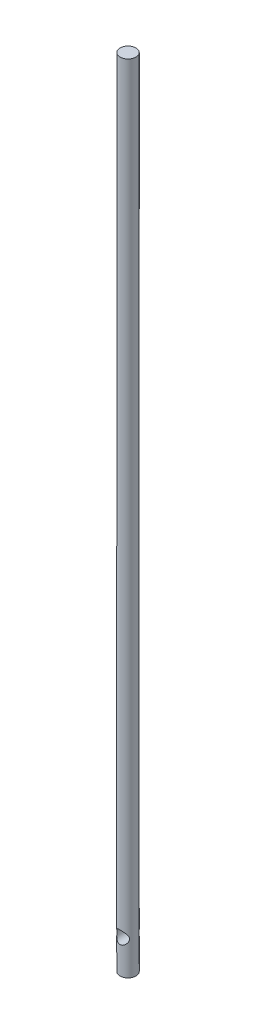
ISO-10303-21;
HEADER;
FILE_DESCRIPTION(('STEP AP214'),'2;1');
FILE_NAME('part.step','',(''),(''),'','','');
FILE_SCHEMA(('AUTOMOTIVE_DESIGN { 1 0 10303 214 1 1 1 1 }'));
ENDSEC;
DATA;
#1=APPLICATION_CONTEXT('core data for automotive mechanical design processes');
#2=APPLICATION_PROTOCOL_DEFINITION('international standard','automotive_design',2000,#1);
#3=PRODUCT_CONTEXT('',#1,'mechanical');
#4=PRODUCT('Part','Part','',(#3));
#5=PRODUCT_RELATED_PRODUCT_CATEGORY('part','',(#4));
#6=PRODUCT_DEFINITION_FORMATION('','',#4);
#7=PRODUCT_DEFINITION_CONTEXT('part definition',#1,'design');
#8=PRODUCT_DEFINITION('design','',#6,#7);
#9=PRODUCT_DEFINITION_SHAPE('','',#8);
#10=(LENGTH_UNIT() NAMED_UNIT(*) SI_UNIT(.MILLI.,.METRE.));
#11=(NAMED_UNIT(*) PLANE_ANGLE_UNIT() SI_UNIT($,.RADIAN.));
#12=(NAMED_UNIT(*) SI_UNIT($,.STERADIAN.) SOLID_ANGLE_UNIT());
#13=UNCERTAINTY_MEASURE_WITH_UNIT(LENGTH_MEASURE(1.E-05),#10,'distance_accuracy_value','');
#14=(GEOMETRIC_REPRESENTATION_CONTEXT(3) GLOBAL_UNCERTAINTY_ASSIGNED_CONTEXT((#13)) GLOBAL_UNIT_ASSIGNED_CONTEXT((#10,
#11,#12)) REPRESENTATION_CONTEXT('',''));
#15=CARTESIAN_POINT('',(0.,0.,0.));
#16=DIRECTION('',(0.,0.,1.));
#17=DIRECTION('',(1.,0.,0.));
#18=AXIS2_PLACEMENT_3D('',#15,#16,#17);
#19=CARTESIAN_POINT('',(0.,150.,0.));
#20=DIRECTION('',(0.,-1.,0.));
#21=DIRECTION('',(0.,0.,-1.));
#22=AXIS2_PLACEMENT_3D('',#19,#20,#21);
#23=CYLINDRICAL_SURFACE('',#22,1.5);
#24=DIRECTION('',(0.,-1.,0.));
#25=VECTOR('',#24,1.);
#26=CARTESIAN_POINT('',(1.2,150.,-0.900000000000006));
#27=LINE('',#26,#25);
#28=CARTESIAN_POINT('',(1.20000000000001,10.9306229712693,-0.899999999999984));
#29=VERTEX_POINT('',#28);
#30=CARTESIAN_POINT('',(1.2,123.985472487059,-0.900000000000007));
#31=VERTEX_POINT('',#30);
#32=EDGE_CURVE('E51',#29,#31,#27,.F.);
#33=ORIENTED_EDGE('',*,*,#32,.T.);
#34=CARTESIAN_POINT('',(1.2,123.985472487059,-0.900000000000002));
#35=CARTESIAN_POINT('',(1.20000379597152,124.008241141092,-0.899988421769051));
#36=CARTESIAN_POINT('',(1.19935171237671,124.030995344568,-0.900864818335987));
#37=CARTESIAN_POINT('',(1.19677380579347,124.07626730715,-0.904289605031));
#38=CARTESIAN_POINT('',(1.19485014367045,124.098785401655,-0.906835158607257));
#39=CARTESIAN_POINT('',(1.1872957434026,124.165171525524,-0.916732465008068));
#40=CARTESIAN_POINT('',(1.17987918100504,124.208511218388,-0.926350808630964));
#41=CARTESIAN_POINT('',(1.15736069729631,124.307919272878,-0.954429377374244));
#42=CARTESIAN_POINT('',(1.14046015532011,124.363006788641,-0.974820455416412));
#43=CARTESIAN_POINT('',(1.09982810438073,124.468814940031,-1.02045110491379));
#44=CARTESIAN_POINT('',(1.07604646211563,124.519499842435,-1.04572579064923));
#45=CARTESIAN_POINT('',(1.01264694209284,124.633713635883,-1.10776879771684));
#46=CARTESIAN_POINT('',(0.970408972520711,124.695319017802,-1.14540529134802));
#47=CARTESIAN_POINT('',(0.875114767435763,124.80991477859,-1.21976744864415));
#48=CARTESIAN_POINT('',(0.822079207567976,124.862921279492,-1.25649470481222));
#49=CARTESIAN_POINT('',(0.716860547634883,124.949731934184,-1.31874142866441));
#50=CARTESIAN_POINT('',(0.666569636231381,124.985261664013,-1.34504317856607));
#51=CARTESIAN_POINT('',(0.559477416211532,125.04888680401,-1.39298689109434));
#52=CARTESIAN_POINT('',(0.50268518991465,125.076992408299,-1.41463523565421));
#53=CARTESIAN_POINT('',(0.3931895960337,125.12050052944,-1.44849406958501));
#54=CARTESIAN_POINT('',(0.341310797441846,125.137222463066,-1.46166475924237));
#55=CARTESIAN_POINT('',(0.234711407110358,125.16357195401,-1.48251567469718));
#56=CARTESIAN_POINT('',(0.179992462378052,125.173203574882,-1.49019904527576));
#57=CARTESIAN_POINT('',(0.0690288367933391,125.18478736027,-1.49944782663458));
#58=CARTESIAN_POINT('',(0.0127795282977063,125.186712813777,-1.50099195754683));
#59=CARTESIAN_POINT('',(-0.0992501528541439,125.182673910964,-1.49776158870682));
#60=CARTESIAN_POINT('',(-0.155030506500741,125.176709236344,-1.49298683404227));
#61=CARTESIAN_POINT('',(-0.261408903545348,125.157831914293,-1.47797036912569));
#62=CARTESIAN_POINT('',(-0.31212368393574,125.145315794376,-1.46804090555009));
#63=CARTESIAN_POINT('',(-0.410500829334207,125.114256238575,-1.44362765637963));
#64=CARTESIAN_POINT('',(-0.45816227317499,125.095710993908,-1.42914250408594));
#65=CARTESIAN_POINT('',(-0.554122405601283,125.05130927328,-1.39491518620292));
#66=CARTESIAN_POINT('',(-0.602039307583846,125.024920203359,-1.37480076774247));
#67=CARTESIAN_POINT('',(-0.692835642600915,124.96674218442,-1.3313586633505));
#68=CARTESIAN_POINT('',(-0.73571344935812,124.93495150018,-1.30802994530972));
#69=CARTESIAN_POINT('',(-0.824531547625251,124.859658547501,-1.25433774240164));
#70=CARTESIAN_POINT('',(-0.869289812565461,124.815092135398,-1.22351390047361));
#71=CARTESIAN_POINT('',(-0.951188034986136,124.719777534196,-1.16099032606037));
#72=CARTESIAN_POINT('',(-0.988309742696429,124.669014988092,-1.12928869616512));
#73=CARTESIAN_POINT('',(-1.05143886251965,124.56662818867,-1.07058501887242));
#74=CARTESIAN_POINT('',(-1.07816635173084,124.515541974705,-1.04342237293823));
#75=CARTESIAN_POINT('',(-1.12442221587202,124.408610088671,-0.993389771838625));
#76=CARTESIAN_POINT('',(-1.14399751625862,124.352798511657,-0.970492337469131));
#77=CARTESIAN_POINT('',(-1.17243395506615,124.246044016715,-0.935854389368956));
#78=CARTESIAN_POINT('',(-1.18254432845917,124.195864281903,-0.922884307029407));
#79=CARTESIAN_POINT('',(-1.19289559254927,124.118490015245,-0.909413575041387));
#80=CARTESIAN_POINT('',(-1.19554493353033,124.092125775905,-0.905917470109911));
#81=CARTESIAN_POINT('',(-1.19910317111515,124.039008093284,-0.901196368348652));
#82=CARTESIAN_POINT('',(-1.20000727269517,124.012253780635,-0.899977628844882));
#83=CARTESIAN_POINT('',(-1.20000000000001,123.985472487059,-0.900000000000055));
#84=B_SPLINE_CURVE_WITH_KNOTS('',3,(#34,#35,#36,#37,#38,#39,#40,#41,#42,#43,#44,#45,#46,#47,#48,
#49,#50,#51,#52,#53,#54,#55,#56,#57,#58,#59,#60,#61,#62,#63,#64,#65,#66,#67,#68,#69,#70,#71,#72,
#73,#74,#75,#76,#77,#78,#79,#80,#81,#82,#83),.UNSPECIFIED.,.F.,.F.,(4,2,2,2,2,2,2,2,2,2,2,2,2,2,
2,2,2,2,2,2,2,2,2,2,4),(0.,0.0682543160829039,0.136392940903482,0.270779738696093,
0.453152803043748,0.636889553840028,0.886604805818232,1.13584631619644,1.33596404855176,
1.53580555230553,1.70332152707142,1.87074142126939,2.03874112396752,2.20674760420422,
2.36559449370376,2.52448908252779,2.69870670317353,2.87298039590935,3.08307483244179,
3.29366566282318,3.48428958120517,3.67363935120096,3.83109814308671,3.91113314478717,
3.99138773042926),.UNSPECIFIED.);
#85=CARTESIAN_POINT('',(-1.2,123.985472487059,-0.899999999999998));
#86=VERTEX_POINT('',#85);
#87=EDGE_CURVE('E11',#31,#86,#84,.T.);
#88=ORIENTED_EDGE('',*,*,#87,.T.);
#89=DIRECTION('',(0.,-1.,0.));
#90=VECTOR('',#89,1.);
#91=CARTESIAN_POINT('',(-1.2,150.,-0.899999999999998));
#92=LINE('',#91,#90);
#93=CARTESIAN_POINT('',(-1.2,10.9306229712693,-0.899999999999998));
#94=VERTEX_POINT('',#93);
#95=EDGE_CURVE('E85',#86,#94,#92,.T.);
#96=ORIENTED_EDGE('',*,*,#95,.T.);
#97=CARTESIAN_POINT('',(-1.2,10.9306229712693,-0.900000000000002));
#98=CARTESIAN_POINT('',(-1.20000379597152,10.9078543172356,-0.899988421769051));
#99=CARTESIAN_POINT('',(-1.19935171237671,10.8851001137596,-0.900864818335987));
#100=CARTESIAN_POINT('',(-1.19677380579347,10.8398281511782,-0.904289605031001));
#101=CARTESIAN_POINT('',(-1.19485014367044,10.8173100566725,-0.906835158607259));
#102=CARTESIAN_POINT('',(-1.1872957434026,10.7509239328043,-0.91673246500807));
#103=CARTESIAN_POINT('',(-1.17987918100504,10.7075842399399,-0.926350808630965));
#104=CARTESIAN_POINT('',(-1.15736069729631,10.6081761854504,-0.954429377374245));
#105=CARTESIAN_POINT('',(-1.14046015532011,10.5530886696869,-0.974820455416414));
#106=CARTESIAN_POINT('',(-1.09982810438073,10.4472805182965,-1.02045110491379));
#107=CARTESIAN_POINT('',(-1.07604646211563,10.3965956158929,-1.04572579064923));
#108=CARTESIAN_POINT('',(-1.01264694209284,10.2823818224449,-1.10776879771683));
#109=CARTESIAN_POINT('',(-0.970408972520721,10.2207764405259,-1.14540529134801));
#110=CARTESIAN_POINT('',(-0.875114767435777,10.1061806797379,-1.21976744864414));
#111=CARTESIAN_POINT('',(-0.822079207567989,10.0531741788355,-1.25649470481222));
#112=CARTESIAN_POINT('',(-0.716860547634892,9.96636352414426,-1.31874142866441));
#113=CARTESIAN_POINT('',(-0.666569636231385,9.93083379431457,-1.34504317856607));
#114=CARTESIAN_POINT('',(-0.559477416211531,9.86720865431831,-1.39298689109434));
#115=CARTESIAN_POINT('',(-0.50268518991465,9.83910305002908,-1.41463523565421));
#116=CARTESIAN_POINT('',(-0.393189596033703,9.79559492888792,-1.44849406958501));
#117=CARTESIAN_POINT('',(-0.34131079744185,9.7788729952616,-1.46166475924237));
#118=CARTESIAN_POINT('',(-0.234711407110362,9.7525235043176,-1.48251567469718));
#119=CARTESIAN_POINT('',(-0.179992462378056,9.74289188344603,-1.49019904527576));
#120=CARTESIAN_POINT('',(-0.0690288367933412,9.73130809805804,-1.49944782663458));
#121=CARTESIAN_POINT('',(-0.0127795282977081,9.7293826445506,-1.50099195754683));
#122=CARTESIAN_POINT('',(0.0992501528541429,9.73342154736441,-1.49776158870682));
#123=CARTESIAN_POINT('',(0.15503050650074,9.73938622198396,-1.49298683404227));
#124=CARTESIAN_POINT('',(0.261408903545349,9.75826354403482,-1.47797036912569));
#125=CARTESIAN_POINT('',(0.312123683935742,9.77077966395147,-1.46804090555009));
#126=CARTESIAN_POINT('',(0.41050082933421,9.80183921975255,-1.44362765637963));
#127=CARTESIAN_POINT('',(0.458162273174991,9.82038446442042,-1.42914250408593));
#128=CARTESIAN_POINT('',(0.554122405601282,9.86478618504766,-1.39491518620292));
#129=CARTESIAN_POINT('',(0.602039307583843,9.89117525496926,-1.37480076774247));
#130=CARTESIAN_POINT('',(0.692835642600914,9.94935327390831,-1.3313586633505));
#131=CARTESIAN_POINT('',(0.735713449358122,9.98114395814788,-1.30802994530972));
#132=CARTESIAN_POINT('',(0.824531547625252,10.0564369108266,-1.25433774240164));
#133=CARTESIAN_POINT('',(0.869289812565459,10.1010033229301,-1.22351390047361));
#134=CARTESIAN_POINT('',(0.951188034986132,10.1963179241322,-1.16099032606037));
#135=CARTESIAN_POINT('',(0.988309742696427,10.2470804702356,-1.12928869616512));
#136=CARTESIAN_POINT('',(1.05143886251965,10.3494672696579,-1.07058501887242));
#137=CARTESIAN_POINT('',(1.07816635173083,10.4005534836227,-1.04342237293823));
#138=CARTESIAN_POINT('',(1.12442221587202,10.5074853696573,-0.993389771838628));
#139=CARTESIAN_POINT('',(1.14399751625862,10.5632969466715,-0.970492337469133));
#140=CARTESIAN_POINT('',(1.17243395506614,10.6700514416132,-0.935854389368959));
#141=CARTESIAN_POINT('',(1.18254432845917,10.7202311764251,-0.922884307029411));
#142=CARTESIAN_POINT('',(1.19289559254927,10.7976054430828,-0.90941357504139));
#143=CARTESIAN_POINT('',(1.19554493353033,10.8239696824225,-0.905917470109913));
#144=CARTESIAN_POINT('',(1.19910317111514,10.8770873650438,-0.901196368348652));
#145=CARTESIAN_POINT('',(1.20000727269517,10.9038416776925,-0.899977628844882));
#146=CARTESIAN_POINT('',(1.20000000000001,10.9306229712694,-0.900000000000055));
#147=B_SPLINE_CURVE_WITH_KNOTS('',3,(#97,#98,#99,#100,#101,#102,#103,#104,#105,#106,#107,#108,
#109,#110,#111,#112,#113,#114,#115,#116,#117,#118,#119,#120,#121,#122,#123,#124,#125,#126,#127,
#128,#129,#130,#131,#132,#133,#134,#135,#136,#137,#138,#139,#140,#141,#142,#143,#144,#145,#146),
.UNSPECIFIED.,.F.,.F.,(4,2,2,2,2,2,2,2,2,2,2,2,2,2,2,2,2,2,2,2,2,2,2,2,4),(0.,
0.0682543160829091,0.136392940903491,0.270779738696089,0.453152803043768,0.636889553840017,
0.886604805818214,1.13584631619643,1.33596404855177,1.53580555230553,1.70332152707142,
1.87074142126939,2.03874112396753,2.20674760420423,2.36559449370377,2.5244890825278,
2.69870670317353,2.87298039590936,3.08307483244178,3.29366566282318,3.48428958120517,
3.67363935120096,3.8310981430867,3.91113314478717,3.99138773042926),.UNSPECIFIED.);
#148=EDGE_CURVE('E161',#94,#29,#147,.T.);
#149=ORIENTED_EDGE('',*,*,#148,.T.);
#150=EDGE_LOOP('',(#33,#88,#96,#149));
#151=FACE_BOUND('',#150,.T.);
#152=CARTESIAN_POINT('',(0.,7.53859725246305,-1.5));
#153=CARTESIAN_POINT('',(-0.0575982276357401,7.53859276327266,-1.49999564250643));
#154=CARTESIAN_POINT('',(-0.115279939854107,7.53441561094531,-1.49664822463738));
#155=CARTESIAN_POINT('',(-0.228791595157823,7.51798727272291,-1.48355560196632));
#156=CARTESIAN_POINT('',(-0.284617154141939,7.50571822550447,-1.47379624420644));
#157=CARTESIAN_POINT('',(-0.392456956504874,7.47399028930094,-1.44880033466293));
#158=CARTESIAN_POINT('',(-0.444493020611465,7.45457724273379,-1.43359872188631));
#159=CARTESIAN_POINT('',(-0.544155792480883,7.40952684524709,-1.3988160649583));
#160=CARTESIAN_POINT('',(-0.591782486274532,7.38388947460939,-1.37923500693322));
#161=CARTESIAN_POINT('',(-0.697908742652547,7.31742023390726,-1.32945398879608));
#162=CARTESIAN_POINT('',(-0.754420607905233,7.27440590347924,-1.29793049174663));
#163=CARTESIAN_POINT('',(-0.858248206774195,7.18023041289839,-1.23175315549046));
#164=CARTESIAN_POINT('',(-0.905536569141872,7.12904580034199,-1.19709043311633));
#165=CARTESIAN_POINT('',(-0.991295513791186,7.0185328620388,-1.12713600986708));
#166=CARTESIAN_POINT('',(-1.02961583077771,6.95908918863057,-1.09184298563546));
#167=CARTESIAN_POINT('',(-1.09588100644736,6.8326739830072,-1.02529265907541));
#168=CARTESIAN_POINT('',(-1.12386059623915,6.76572865233579,-0.994022081733874));
#169=CARTESIAN_POINT('',(-1.15851626266985,6.65426988136005,-0.953013914274201));
#170=CARTESIAN_POINT('',(-1.169192855045,6.61231020936203,-0.939772368012977));
#171=CARTESIAN_POINT('',(-1.186040380907,6.52626964167813,-0.9184193362699));
#172=CARTESIAN_POINT('',(-1.19222239132238,6.48219424825082,-0.910295245437391));
#173=CARTESIAN_POINT('',(-1.19963904082566,6.39248174121034,-0.900505404001465));
#174=CARTESIAN_POINT('',(-1.20083007367254,6.34683436158941,-0.898896581460972));
#175=CARTESIAN_POINT('',(-1.19801689020611,6.25597431722456,-0.902639773915306));
#176=CARTESIAN_POINT('',(-1.19400827706882,6.21076205299788,-0.907997679989633));
#177=CARTESIAN_POINT('',(-1.18017181626898,6.11526387090166,-0.925924327767224));
#178=CARTESIAN_POINT('',(-1.16953084923298,6.06529244883237,-0.939491052288274));
#179=CARTESIAN_POINT('',(-1.14266728409384,5.96867591673912,-0.9719847596266));
#180=CARTESIAN_POINT('',(-1.12642815385385,5.92204115853857,-0.990927589194804));
#181=CARTESIAN_POINT('',(-1.07984461316395,5.81019998883936,-1.04193669695209));
#182=CARTESIAN_POINT('',(-1.04648931957213,5.74711563348116,-1.0758802378068));
#183=CARTESIAN_POINT('',(-0.969830804986113,5.62836724578284,-1.14548268036625));
#184=CARTESIAN_POINT('',(-0.926513081417838,5.57271421995537,-1.18114402229772));
#185=CARTESIAN_POINT('',(-0.82887490995524,5.46783238962161,-1.25167651180649));
#186=CARTESIAN_POINT('',(-0.774292206150034,5.41881409908544,-1.28650133554988));
#187=CARTESIAN_POINT('',(-0.65519094644773,5.33053755279664,-1.35103122898472));
#188=CARTESIAN_POINT('',(-0.5906997871644,5.29125314277103,-1.38074995098946));
#189=CARTESIAN_POINT('',(-0.472666688597155,5.23425954403258,-1.42454751382089));
#190=CARTESIAN_POINT('',(-0.421306636296694,5.21359454984959,-1.44066642721889));
#191=CARTESIAN_POINT('',(-0.314948354343038,5.17932138182034,-1.46758538479455));
#192=CARTESIAN_POINT('',(-0.259952902135084,5.16570788931153,-1.47838943744653));
#193=CARTESIAN_POINT('',(-0.147427939933311,5.14631412448678,-1.49382201364378));
#194=CARTESIAN_POINT('',(-0.0898867829309253,5.14057477830833,-1.49841827005469));
#195=CARTESIAN_POINT('',(0.0255648003241329,5.13748182238517,-1.50089209795817));
#196=CARTESIAN_POINT('',(0.0834751557852793,5.14012665058674,-1.49877092097438));
#197=CARTESIAN_POINT('',(0.193048009282514,5.15304694458546,-1.48846114586595));
#198=CARTESIAN_POINT('',(0.24483655225551,5.16268676607245,-1.48077809290982));
#199=CARTESIAN_POINT('',(0.345801387330559,5.18832055259548,-1.46050510080778));
#200=CARTESIAN_POINT('',(0.394976899269325,5.20431640337711,-1.44791370544592));
#201=CARTESIAN_POINT('',(0.492741594535014,5.24308750924052,-1.41773901150737));
#202=CARTESIAN_POINT('',(0.541106432684894,5.26622085341849,-1.39989514984719));
#203=CARTESIAN_POINT('',(0.633245741643508,5.31791441405467,-1.36070206292314));
#204=CARTESIAN_POINT('',(0.677019983363224,5.34647490114909,-1.33935266285523));
#205=CARTESIAN_POINT('',(0.767552586278585,5.41413241882497,-1.28996067279979));
#206=CARTESIAN_POINT('',(0.813309027366425,5.4542006030048,-1.2614159216418));
#207=CARTESIAN_POINT('',(0.897917398403496,5.5402270862512,-1.20266690179947));
#208=CARTESIAN_POINT('',(0.936748897803787,5.58620214755364,-1.17245805585552));
#209=CARTESIAN_POINT('',(1.01480225542667,5.69398826703945,-1.10603716587112));
#210=CARTESIAN_POINT('',(1.05233967431383,5.75708518964639,-1.06991946977431));
#211=CARTESIAN_POINT('',(1.11603282868326,5.89143978385831,-1.0032811577246));
#212=CARTESIAN_POINT('',(1.14223810432883,5.96266017872194,-0.97273652430313));
#213=CARTESIAN_POINT('',(1.17216272924156,6.07826137612265,-0.93611942264654));
#214=CARTESIAN_POINT('',(1.18067781786882,6.1198541054513,-0.925259076475235));
#215=CARTESIAN_POINT('',(1.19327297536227,6.20469657433097,-0.908959455343827));
#216=CARTESIAN_POINT('',(1.19736423248387,6.2479418459917,-0.903506507514637));
#217=CARTESIAN_POINT('',(1.20079245883071,6.33520741950403,-0.898948628112401));
#218=CARTESIAN_POINT('',(1.20010388267397,6.37923062951321,-0.899877804942942));
#219=CARTESIAN_POINT('',(1.19397915332709,6.46638726291914,-0.907984580665246));
#220=CARTESIAN_POINT('',(1.18853547315413,6.50951916458294,-0.915172085976952));
#221=CARTESIAN_POINT('',(1.17124615436776,6.6053626885866,-0.937242447930151));
#222=CARTESIAN_POINT('',(1.15805398477353,6.65745651984377,-0.953695412774876));
#223=CARTESIAN_POINT('',(1.12565046512735,6.75777190572553,-0.991733584004226));
#224=CARTESIAN_POINT('',(1.10642138280991,6.80598152011658,-1.01333386400495));
#225=CARTESIAN_POINT('',(1.05264614722556,6.91953170457321,-1.06960339817589));
#226=CARTESIAN_POINT('',(1.01510904746975,6.98271815758225,-1.10575508062358));
#227=CARTESIAN_POINT('',(0.929471826327767,7.10110537325101,-1.17867160262971));
#228=CARTESIAN_POINT('',(0.881359730695774,7.15629696470591,-1.21543709325133));
#229=CARTESIAN_POINT('',(0.774042242768759,7.25861016414338,-1.28649119279118));
#230=CARTESIAN_POINT('',(0.714700543135367,7.30561731721066,-1.32074131022816));
#231=CARTESIAN_POINT('',(0.58583217363521,7.38865797258728,-1.38270368904217));
#232=CARTESIAN_POINT('',(0.516336461722297,7.42472383986389,-1.41043517700999));
#233=CARTESIAN_POINT('',(0.393001928351172,7.47367878041533,-1.44853762193535));
#234=CARTESIAN_POINT('',(0.341460765033331,7.49029035874022,-1.46162052216034));
#235=CARTESIAN_POINT('',(0.23563322300029,7.5164883625327,-1.48235003336826));
#236=CARTESIAN_POINT('',(0.18135443811138,7.52609318927941,-1.49001088226659));
#237=CARTESIAN_POINT('',(0.105528243961687,7.53413527269397,-1.49643245495926));
#238=CARTESIAN_POINT('',(0.0844850447962482,7.5358057363068,-1.49776756371041));
#239=CARTESIAN_POINT('',(0.0422983318509325,7.53803767397067,-1.49955223496619));
#240=CARTESIAN_POINT('',(0.0211547967988394,7.53859890126223,-1.5000016004293));
#241=CARTESIAN_POINT('',(0.,7.53859725246305,-1.5));
#242=B_SPLINE_CURVE_WITH_KNOTS('',3,(#152,#153,#154,#155,#156,#157,#158,#159,#160,#161,#162,
#163,#164,#165,#166,#167,#168,#169,#170,#171,#172,#173,#174,#175,#176,#177,#178,#179,#180,#181,
#182,#183,#184,#185,#186,#187,#188,#189,#190,#191,#192,#193,#194,#195,#196,#197,#198,#199,#200,
#201,#202,#203,#204,#205,#206,#207,#208,#209,#210,#211,#212,#213,#214,#215,#216,#217,#218,#219,
#220,#221,#222,#223,#224,#225,#226,#227,#228,#229,#230,#231,#232,#233,#234,#235,#236,#237,#238,
#239,#240,#241),.UNSPECIFIED.,.T.,.F.,(4,2,2,2,2,2,2,2,2,2,2,2,2,2,2,2,2,2,2,2,2,2,2,2,2,2,2,2,
2,2,2,2,2,2,2,2,2,2,2,2,2,2,2,2,4),(0.,0.172701963595326,0.345786415583605,0.517779034350361,
0.689772197982483,0.921647329200605,1.15420042912711,1.39040845059288,1.62581575755076,
1.76120691797564,1.89626326429301,2.0324971708489,2.16884635201729,2.32655178003641,
2.48472698081858,2.72055448897415,2.9567274951644,3.19918903957487,3.44099186408841,
3.61328386859316,3.78544573027756,3.95849906168414,4.13152015345698,4.29052202947331,
4.44957111440179,4.61845651815375,4.78735034595245,4.9881932233403,5.18961917966976,
5.43402162411406,5.67734455139746,5.80833726801355,5.93899791212207,6.07035739568802,
6.20192518931013,6.36958429932659,6.53774055728835,6.7822069133324,7.02695152200661,
7.2748834167521,7.52207459799329,7.68854760045129,7.85458181842817,7.9179980487662,
7.98142838502107),.UNSPECIFIED.);
#243=CARTESIAN_POINT('',(0.,7.53859725246305,-1.5));
#244=VERTEX_POINT('',#243);
#245=EDGE_CURVE('E116',#244,#244,#242,.T.);
#246=ORIENTED_EDGE('',*,*,#245,.T.);
#247=EDGE_LOOP('',(#246));
#248=FACE_BOUND('',#247,.T.);
#249=CARTESIAN_POINT('',(1.2,6.33859725246306,0.900000000000002));
#250=CARTESIAN_POINT('',(1.19999397383052,6.29354864202992,0.900013654559463));
#251=CARTESIAN_POINT('',(1.19743345808975,6.24842989680689,0.903453532056103));
#252=CARTESIAN_POINT('',(1.18742610260783,6.15960853480529,0.916558782589813));
#253=CARTESIAN_POINT('',(1.17996249563353,6.11591131937578,0.926245516076783));
#254=CARTESIAN_POINT('',(1.15732973407476,6.01603400075793,0.954469882586409));
#255=CARTESIAN_POINT('',(1.1403815271167,5.96081174820333,0.97491569665437));
#256=CARTESIAN_POINT('',(1.09971847747341,5.85501636836628,1.02056719807706));
#257=CARTESIAN_POINT('',(1.07598456410244,5.80445688266277,1.04578623169827));
#258=CARTESIAN_POINT('',(1.01266653967304,5.69039345839475,1.10774979995627));
#259=CARTESIAN_POINT('',(0.970454182270563,5.62881730798669,1.14536512868958));
#260=CARTESIAN_POINT('',(0.875171610388437,5.51421115133573,1.21972798048742));
#261=CARTESIAN_POINT('',(0.822110446093203,5.46117408719472,1.25647619858682));
#262=CARTESIAN_POINT('',(0.716856157672838,5.37433430071657,1.31874404636706));
#263=CARTESIAN_POINT('',(0.666560256880135,5.33880148285261,1.34504808472804));
#264=CARTESIAN_POINT('',(0.559466853304538,5.27517767648328,1.39299091513961));
#265=CARTESIAN_POINT('',(0.50267965325697,5.24707512354253,1.41463694700221));
#266=CARTESIAN_POINT('',(0.393190249333529,5.20356947611466,1.44849386817827));
#267=CARTESIAN_POINT('',(0.341312151453417,5.18684771371739,1.46166441654836));
#268=CARTESIAN_POINT('',(0.234712831753194,5.16049803531066,1.48251547370988));
#269=CARTESIAN_POINT('',(0.179993182387573,5.15086623971703,1.49019898490392));
#270=CARTESIAN_POINT('',(0.0690290010819161,5.13928239648898,1.4994478133017));
#271=CARTESIAN_POINT('',(0.0127798628236203,5.13735693684987,1.50099194863285));
#272=CARTESIAN_POINT('',(-0.0992498198568851,5.14139579338637,1.49776161686854));
#273=CARTESIAN_POINT('',(-0.15503034247334,5.14736047468418,1.49298685736147));
#274=CARTESIAN_POINT('',(-0.26141014106166,5.16623804425089,1.47797019428088));
#275=CARTESIAN_POINT('',(-0.3121261133505,5.1787545426367,1.46804042914309));
#276=CARTESIAN_POINT('',(-0.410503117303456,5.2098143930144,1.4436269619635));
#277=CARTESIAN_POINT('',(-0.458163374477863,5.2283592657616,1.4291421108574));
#278=CARTESIAN_POINT('',(-0.55411639094066,5.27275767161617,1.39491733198087));
#279=CARTESIAN_POINT('',(-0.60202781575983,5.29914316207188,1.37480559396153));
#280=CARTESIAN_POINT('',(-0.692825348174017,5.35731996821808,1.33136426187888));
#281=CARTESIAN_POINT('',(-0.735708619778836,5.38911431008091,1.30803286785307));
#282=CARTESIAN_POINT('',(-0.82455912813664,5.46443437374237,1.25432106588145));
#283=CARTESIAN_POINT('',(-0.869340652431042,5.50902742098598,1.2234788657422));
#284=CARTESIAN_POINT('',(-0.951230309962028,5.6043507946535,1.16095426755426));
#285=CARTESIAN_POINT('',(-0.988328966616243,5.65508857966762,1.12927088561461));
#286=CARTESIAN_POINT('',(-1.05137117094483,5.75732936995381,1.07064790575862));
#287=CARTESIAN_POINT('',(-1.07804504397567,5.80828781677128,1.0435453473228));
#288=CARTESIAN_POINT('',(-1.12433464192787,5.91521713226377,0.993492634639253));
#289=CARTESIAN_POINT('',(-1.14396579523703,5.97117670466564,0.970533459100137));
#290=CARTESIAN_POINT('',(-1.17037319841584,6.07027221487971,0.938362830859945));
#291=CARTESIAN_POINT('',(-1.1792417622887,6.1121649510018,0.92709361173274));
#292=CARTESIAN_POINT('',(-1.19248186873425,6.19770537603555,0.910003828086607));
#293=CARTESIAN_POINT('',(-1.19686343747991,6.24134892480945,0.904171118342242));
#294=CARTESIAN_POINT('',(-1.20077996655852,6.32951527921948,0.898966741763458));
#295=CARTESIAN_POINT('',(-1.20028683758554,6.37404170349753,0.899632520673439));
#296=CARTESIAN_POINT('',(-1.19443566156634,6.46222564748551,0.907382737114518));
#297=CARTESIAN_POINT('',(-1.18907074999259,6.50588185229553,0.914476231511792));
#298=CARTESIAN_POINT('',(-1.17198858269522,6.60203517406015,0.936309050584642));
#299=CARTESIAN_POINT('',(-1.15900255734528,6.65395621334156,0.952534328917371));
#300=CARTESIAN_POINT('',(-1.12704833070315,6.75397177211434,0.990136856038848));
#301=CARTESIAN_POINT('',(-1.1080622944039,6.80205434100492,1.01152941929454));
#302=CARTESIAN_POINT('',(-1.0548456535189,6.91551461007263,1.06741949996334));
#303=CARTESIAN_POINT('',(-1.01761506566959,6.97873445305815,1.10343338608514));
#304=CARTESIAN_POINT('',(-0.932628237387947,7.09722774200826,1.1761611189461));
#305=CARTESIAN_POINT('',(-0.884859609284172,7.15249170827313,1.21287574262658));
#306=CARTESIAN_POINT('',(-0.77821382464525,7.25507493687008,1.28395979555495));
#307=CARTESIAN_POINT('',(-0.719189163137782,7.3022708299309,1.31828872955796));
#308=CARTESIAN_POINT('',(-0.590982166644796,7.38575716892957,1.38049827773625));
#309=CARTESIAN_POINT('',(-0.521833922073119,7.42208301586543,1.40839975464384));
#310=CARTESIAN_POINT('',(-0.398719196484588,7.47169160494319,1.4469789711629));
#311=CARTESIAN_POINT('',(-0.347044959074005,7.48862767864752,1.46030952929931));
#312=CARTESIAN_POINT('',(-0.240819228741383,7.51545653344144,1.48152930234908));
#313=CARTESIAN_POINT('',(-0.18626996650744,7.52535469118743,1.48942267089044));
#314=CARTESIAN_POINT('',(-0.0755768148313866,7.53751294692588,1.49912819834397));
#315=CARTESIAN_POINT('',(-0.019427853687274,7.53974517549805,1.50091816823496));
#316=CARTESIAN_POINT('',(0.0924776969829282,7.53633734690393,1.49819231996016));
#317=CARTESIAN_POINT('',(0.14823425860271,7.53069673541808,1.49367605777827));
#318=CARTESIAN_POINT('',(0.254690989984704,7.51243512420833,1.47914405043057));
#319=CARTESIAN_POINT('',(0.305502095460967,7.50020365362135,1.46943540183661));
#320=CARTESIAN_POINT('',(0.404112325414045,7.46968519967498,1.44543121177806));
#321=CARTESIAN_POINT('',(0.451910665982114,7.45139664796745,1.4311344823605));
#322=CARTESIAN_POINT('',(0.54803015511112,7.40757252582752,1.39731721924328));
#323=CARTESIAN_POINT('',(0.595986052892383,7.38152094719646,1.37743438201255));
#324=CARTESIAN_POINT('',(0.686918376757832,7.32401185020628,1.33442037605756));
#325=CARTESIAN_POINT('',(0.729892138657848,7.29255146162196,1.3112874838651));
#326=CARTESIAN_POINT('',(0.818929343972384,7.21801952466085,1.25800111457922));
#327=CARTESIAN_POINT('',(0.863824822761842,7.17388940447381,1.22737979501995));
#328=CARTESIAN_POINT('',(0.946016118479942,7.07952709714902,1.16520787752036));
#329=CARTESIAN_POINT('',(0.983302371498319,7.02928735589986,1.133656166471));
#330=CARTESIAN_POINT('',(1.04730756819804,6.92722272574531,1.07465475193087));
#331=CARTESIAN_POINT('',(1.07463684038795,6.87585373973342,1.04707957810529));
#332=CARTESIAN_POINT('',(1.12209782811139,6.76796211951224,0.996044699418834));
#333=CARTESIAN_POINT('',(1.14224301815787,6.71144938564042,0.972577332490384));
#334=CARTESIAN_POINT('',(1.16948483953463,6.61091365641146,0.93948061164683));
#335=CARTESIAN_POINT('',(1.17867882509378,6.56814552581874,0.927811323772403));
#336=CARTESIAN_POINT('',(1.19235769574377,6.48078268988054,0.910172833353847));
#337=CARTESIAN_POINT('',(1.19686050683936,6.43619561929629,0.904181940400955));
#338=CARTESIAN_POINT('',(1.19961445336698,6.37380212385766,0.900512760794415));
#339=CARTESIAN_POINT('',(1.20000235540107,6.35620504551698,0.899994662950648));
#340=CARTESIAN_POINT('',(1.2,6.33859725246306,0.900000000000002));
#341=B_SPLINE_CURVE_WITH_KNOTS('',3,(#249,#250,#251,#252,#253,#254,#255,#256,#257,#258,#259,
#260,#261,#262,#263,#264,#265,#266,#267,#268,#269,#270,#271,#272,#273,#274,#275,#276,#277,#278,
#279,#280,#281,#282,#283,#284,#285,#286,#287,#288,#289,#290,#291,#292,#293,#294,#295,#296,#297,
#298,#299,#300,#301,#302,#303,#304,#305,#306,#307,#308,#309,#310,#311,#312,#313,#314,#315,#316,
#317,#318,#319,#320,#321,#322,#323,#324,#325,#326,#327,#328,#329,#330,#331,#332,#333,#334,#335,
#336,#337,#338,#339,#340),.UNSPECIFIED.,.T.,.F.,(4,2,2,2,2,2,2,2,2,2,2,2,2,2,2,2,2,2,2,2,2,2,2,
2,2,2,2,2,2,2,2,2,2,2,2,2,2,2,2,2,2,2,2,2,2,4),(0.,0.135084491287975,0.27063335633701,
0.453428630796529,0.636742773569784,0.886324827670043,1.13569952122128,1.33583581907458,
1.53565876710615,1.70317256661107,1.87059463536563,2.03859383956757,2.20660081833125,
2.36545150500778,2.52434229548775,2.69853906413057,2.87283361575691,3.08304735927843,
3.2935188706264,3.4837151603098,3.67349220802222,3.80584635770902,3.9379041129625,
4.07072326169673,4.20372984856055,4.37057136226317,4.53791355178448,4.781854871854,
5.02608449237142,5.27376704968891,5.52063396155906,5.6879155656789,5.85506923634551,
6.02282995313264,6.19060248239616,6.34940065189872,6.50823997088737,6.68186015305214,
6.85557275404763,7.06484111434696,7.27437090226765,7.46697444552425,7.65921481638092,
7.79454829960211,7.92936272574336,7.98216212942137),.UNSPECIFIED.);
#342=CARTESIAN_POINT('',(1.2,6.33859725246306,0.900000000000002));
#343=VERTEX_POINT('',#342);
#344=EDGE_CURVE('E106',#343,#343,#341,.T.);
#345=ORIENTED_EDGE('',*,*,#344,.T.);
#346=EDGE_LOOP('',(#345));
#347=FACE_BOUND('',#346,.T.);
#348=CARTESIAN_POINT('',(0.,150.,0.));
#349=DIRECTION('',(0.,1.,0.));
#350=DIRECTION('',(0.,0.,1.));
#351=AXIS2_PLACEMENT_3D('',#348,#349,#350);
#352=CIRCLE('',#351,1.5);
#353=CARTESIAN_POINT('',(0.,150.,1.5));
#354=VERTEX_POINT('',#353);
#355=EDGE_CURVE('E110',#354,#354,#352,.T.);
#356=ORIENTED_EDGE('',*,*,#355,.F.);
#357=EDGE_LOOP('',(#356));
#358=FACE_BOUND('',#357,.T.);
#359=CARTESIAN_POINT('',(0.,0.,0.));
#360=DIRECTION('',(0.,1.,0.));
#361=DIRECTION('',(0.,0.,1.));
#362=AXIS2_PLACEMENT_3D('',#359,#360,#361);
#363=CIRCLE('',#362,1.5);
#364=CARTESIAN_POINT('',(0.,0.,1.5));
#365=VERTEX_POINT('',#364);
#366=EDGE_CURVE('E113',#365,#365,#363,.T.);
#367=ORIENTED_EDGE('',*,*,#366,.T.);
#368=EDGE_LOOP('',(#367));
#369=FACE_BOUND('',#368,.T.);
#370=ADVANCED_FACE('F38',(#151,#248,#347,#358,#369),#23,.T.);
#371=CARTESIAN_POINT('',(0.,150.,0.));
#372=DIRECTION('',(0.,1.,0.));
#373=DIRECTION('',(0.,0.,1.));
#374=AXIS2_PLACEMENT_3D('',#371,#372,#373);
#375=PLANE('',#374);
#376=ORIENTED_EDGE('',*,*,#355,.T.);
#377=EDGE_LOOP('',(#376));
#378=FACE_BOUND('',#377,.T.);
#379=ADVANCED_FACE('F135',(#378),#375,.T.);
#380=CARTESIAN_POINT('',(0.,0.,0.));
#381=DIRECTION('',(0.,1.,0.));
#382=DIRECTION('',(0.,0.,1.));
#383=AXIS2_PLACEMENT_3D('',#380,#381,#382);
#384=PLANE('',#383);
#385=ORIENTED_EDGE('',*,*,#366,.F.);
#386=EDGE_LOOP('',(#385));
#387=FACE_BOUND('',#386,.T.);
#388=ADVANCED_FACE('F131',(#387),#384,.F.);
#389=CARTESIAN_POINT('',(0.,6.33859725246306,-150.));
#390=DIRECTION('',(0.,0.,1.));
#391=DIRECTION('',(1.,0.,0.));
#392=AXIS2_PLACEMENT_3D('',#389,#390,#391);
#393=CYLINDRICAL_SURFACE('',#392,1.2);
#394=ORIENTED_EDGE('',*,*,#344,.F.);
#395=EDGE_LOOP('',(#394));
#396=FACE_BOUND('',#395,.T.);
#397=ORIENTED_EDGE('',*,*,#245,.F.);
#398=EDGE_LOOP('',(#397));
#399=FACE_BOUND('',#398,.T.);
#400=ADVANCED_FACE('F127',(#396,#399),#393,.F.);
#401=CARTESIAN_POINT('',(0.,123.985472487059,-10.));
#402=DIRECTION('',(0.,0.,1.));
#403=DIRECTION('',(1.,0.,0.));
#404=AXIS2_PLACEMENT_3D('',#401,#402,#403);
#405=CYLINDRICAL_SURFACE('',#404,1.2);
#406=DIRECTION('',(0.,0.,1.));
#407=VECTOR('',#406,1.);
#408=CARTESIAN_POINT('',(1.2,123.985472487059,-10.));
#409=LINE('',#408,#407);
#410=CARTESIAN_POINT('',(1.2,123.985472487059,0.));
#411=VERTEX_POINT('',#410);
#412=EDGE_CURVE('E100',#31,#411,#409,.T.);
#413=ORIENTED_EDGE('',*,*,#412,.T.);
#414=CARTESIAN_POINT('',(0.,123.985472487059,0.));
#415=DIRECTION('',(0.,0.,1.));
#416=DIRECTION('',(1.,0.,0.));
#417=AXIS2_PLACEMENT_3D('',#414,#415,#416);
#418=CIRCLE('',#417,1.2);
#419=CARTESIAN_POINT('',(-1.2,123.985472487059,0.));
#420=VERTEX_POINT('',#419);
#421=EDGE_CURVE('E94',#411,#420,#418,.T.);
#422=ORIENTED_EDGE('',*,*,#421,.T.);
#423=DIRECTION('',(0.,0.,1.));
#424=VECTOR('',#423,1.);
#425=CARTESIAN_POINT('',(-1.2,123.985472487059,-10.));
#426=LINE('',#425,#424);
#427=EDGE_CURVE('E80',#86,#420,#426,.T.);
#428=ORIENTED_EDGE('',*,*,#427,.F.);
#429=ORIENTED_EDGE('',*,*,#87,.F.);
#430=EDGE_LOOP('',(#413,#422,#428,#429));
#431=FACE_BOUND('',#430,.T.);
#432=ADVANCED_FACE('F99',(#431),#405,.F.);
#433=CARTESIAN_POINT('',(1.2,123.985472487059,-10.));
#434=DIRECTION('',(1.,0.,0.));
#435=DIRECTION('',(0.,1.,0.));
#436=AXIS2_PLACEMENT_3D('',#433,#434,#435);
#437=PLANE('',#436);
#438=DIRECTION('',(0.,0.,1.));
#439=VECTOR('',#438,1.);
#440=CARTESIAN_POINT('',(1.20000000000001,10.9306229712693,-10.));
#441=LINE('',#440,#439);
#442=CARTESIAN_POINT('',(1.20000000000001,10.9306229712693,0.));
#443=VERTEX_POINT('',#442);
#444=EDGE_CURVE('E107',#29,#443,#441,.T.);
#445=ORIENTED_EDGE('',*,*,#444,.T.);
#446=DIRECTION('',(0.,1.,0.));
#447=VECTOR('',#446,1.);
#448=CARTESIAN_POINT('',(1.2,123.985472487059,0.));
#449=LINE('',#448,#447);
#450=EDGE_CURVE('E87',#443,#411,#449,.T.);
#451=ORIENTED_EDGE('',*,*,#450,.T.);
#452=ORIENTED_EDGE('',*,*,#412,.F.);
#453=ORIENTED_EDGE('',*,*,#32,.F.);
#454=EDGE_LOOP('',(#445,#451,#452,#453));
#455=FACE_BOUND('',#454,.T.);
#456=ADVANCED_FACE('F174',(#455),#437,.F.);
#457=CARTESIAN_POINT('',(0.,10.9306229712693,-10.));
#458=DIRECTION('',(0.,0.,1.));
#459=DIRECTION('',(1.,0.,0.));
#460=AXIS2_PLACEMENT_3D('',#457,#458,#459);
#461=CYLINDRICAL_SURFACE('',#460,1.2);
#462=DIRECTION('',(0.,0.,1.));
#463=VECTOR('',#462,1.);
#464=CARTESIAN_POINT('',(-1.2,10.9306229712693,-10.));
#465=LINE('',#464,#463);
#466=CARTESIAN_POINT('',(-1.2,10.9306229712693,0.));
#467=VERTEX_POINT('',#466);
#468=EDGE_CURVE('E58',#94,#467,#465,.T.);
#469=ORIENTED_EDGE('',*,*,#468,.T.);
#470=CARTESIAN_POINT('',(0.,10.9306229712693,0.));
#471=DIRECTION('',(0.,0.,1.));
#472=DIRECTION('',(1.,0.,0.));
#473=AXIS2_PLACEMENT_3D('',#470,#471,#472);
#474=CIRCLE('',#473,1.2);
#475=EDGE_CURVE('E97',#467,#443,#474,.T.);
#476=ORIENTED_EDGE('',*,*,#475,.T.);
#477=ORIENTED_EDGE('',*,*,#444,.F.);
#478=ORIENTED_EDGE('',*,*,#148,.F.);
#479=EDGE_LOOP('',(#469,#476,#477,#478));
#480=FACE_BOUND('',#479,.T.);
#481=ADVANCED_FACE('F170',(#480),#461,.F.);
#482=CARTESIAN_POINT('',(-1.2,123.985472487059,-10.));
#483=DIRECTION('',(-1.,0.,0.));
#484=DIRECTION('',(0.,-1.,0.));
#485=AXIS2_PLACEMENT_3D('',#482,#483,#484);
#486=PLANE('',#485);
#487=ORIENTED_EDGE('',*,*,#427,.T.);
#488=DIRECTION('',(0.,-1.,0.));
#489=VECTOR('',#488,1.);
#490=CARTESIAN_POINT('',(-1.2,123.985472487059,0.));
#491=LINE('',#490,#489);
#492=EDGE_CURVE('E83',#420,#467,#491,.T.);
#493=ORIENTED_EDGE('',*,*,#492,.T.);
#494=ORIENTED_EDGE('',*,*,#468,.F.);
#495=ORIENTED_EDGE('',*,*,#95,.F.);
#496=EDGE_LOOP('',(#487,#493,#494,#495));
#497=FACE_BOUND('',#496,.T.);
#498=ADVANCED_FACE('F82',(#497),#486,.F.);
#499=CARTESIAN_POINT('',(0.,123.985472487059,0.));
#500=DIRECTION('',(0.,0.,1.));
#501=DIRECTION('',(1.,0.,0.));
#502=AXIS2_PLACEMENT_3D('',#499,#500,#501);
#503=PLANE('',#502);
#504=ORIENTED_EDGE('',*,*,#421,.F.);
#505=ORIENTED_EDGE('',*,*,#450,.F.);
#506=ORIENTED_EDGE('',*,*,#475,.F.);
#507=ORIENTED_EDGE('',*,*,#492,.F.);
#508=EDGE_LOOP('',(#504,#505,#506,#507));
#509=FACE_BOUND('',#508,.T.);
#510=ADVANCED_FACE('F92',(#509),#503,.F.);
#511=CLOSED_SHELL('',(#370,#379,#388,#400,#432,#456,#481,#498,#510));
#512=MANIFOLD_SOLID_BREP('B2',#511);
#513=ADVANCED_BREP_SHAPE_REPRESENTATION('',(#18,#512),#14);
#514=SHAPE_DEFINITION_REPRESENTATION(#9,#513);
ENDSEC;
END-ISO-10303-21;
